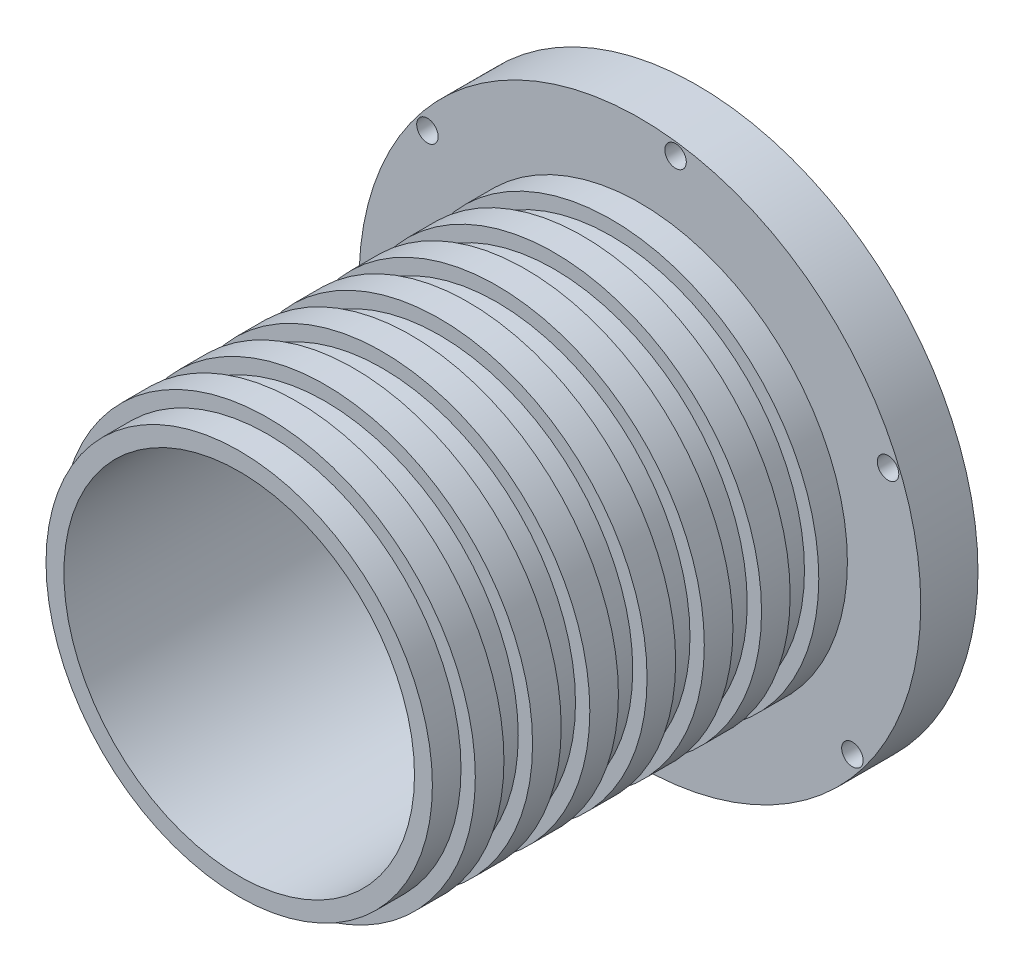
ISO-10303-21;
HEADER;
FILE_DESCRIPTION(('STEP AP214'),'2;1');
FILE_NAME('part.step','',(''),(''),'','','');
FILE_SCHEMA(('AUTOMOTIVE_DESIGN { 1 0 10303 214 1 1 1 1 }'));
ENDSEC;
DATA;
#1=APPLICATION_CONTEXT('core data for automotive mechanical design processes');
#2=APPLICATION_PROTOCOL_DEFINITION('international standard','automotive_design',2000,#1);
#3=PRODUCT_CONTEXT('',#1,'mechanical');
#4=PRODUCT('Part','Part','',(#3));
#5=PRODUCT_RELATED_PRODUCT_CATEGORY('part','',(#4));
#6=PRODUCT_DEFINITION_FORMATION('','',#4);
#7=PRODUCT_DEFINITION_CONTEXT('part definition',#1,'design');
#8=PRODUCT_DEFINITION('design','',#6,#7);
#9=PRODUCT_DEFINITION_SHAPE('','',#8);
#10=(LENGTH_UNIT() NAMED_UNIT(*) SI_UNIT(.MILLI.,.METRE.));
#11=(NAMED_UNIT(*) PLANE_ANGLE_UNIT() SI_UNIT($,.RADIAN.));
#12=(NAMED_UNIT(*) SI_UNIT($,.STERADIAN.) SOLID_ANGLE_UNIT());
#13=UNCERTAINTY_MEASURE_WITH_UNIT(LENGTH_MEASURE(1.E-05),#10,'distance_accuracy_value','');
#14=(GEOMETRIC_REPRESENTATION_CONTEXT(3) GLOBAL_UNCERTAINTY_ASSIGNED_CONTEXT((#13)) GLOBAL_UNIT_ASSIGNED_CONTEXT((#10,
#11,#12)) REPRESENTATION_CONTEXT('',''));
#15=CARTESIAN_POINT('',(0.,0.,0.));
#16=DIRECTION('',(0.,0.,1.));
#17=DIRECTION('',(1.,0.,0.));
#18=AXIS2_PLACEMENT_3D('',#15,#16,#17);
#19=CARTESIAN_POINT('',(0.,0.,68.));
#20=DIRECTION('',(0.,0.,-1.));
#21=DIRECTION('',(-1.,0.,0.));
#22=AXIS2_PLACEMENT_3D('',#19,#20,#21);
#23=CYLINDRICAL_SURFACE('',#22,27.);
#24=CARTESIAN_POINT('',(0.,0.,56.));
#25=DIRECTION('',(0.,0.,1.));
#26=DIRECTION('',(1.,0.,0.));
#27=AXIS2_PLACEMENT_3D('',#24,#25,#26);
#28=CIRCLE('',#27,27.);
#29=CARTESIAN_POINT('',(27.,0.,56.));
#30=VERTEX_POINT('',#29);
#31=EDGE_CURVE('E65',#30,#30,#28,.T.);
#32=ORIENTED_EDGE('',*,*,#31,.T.);
#33=EDGE_LOOP('',(#32));
#34=FACE_BOUND('',#33,.T.);
#35=CARTESIAN_POINT('',(0.,0.,60.));
#36=DIRECTION('',(0.,0.,1.));
#37=DIRECTION('',(1.,0.,0.));
#38=AXIS2_PLACEMENT_3D('',#35,#36,#37);
#39=CIRCLE('',#38,27.);
#40=CARTESIAN_POINT('',(27.,0.,60.));
#41=VERTEX_POINT('',#40);
#42=EDGE_CURVE('E10',#41,#41,#39,.T.);
#43=ORIENTED_EDGE('',*,*,#42,.F.);
#44=EDGE_LOOP('',(#43));
#45=FACE_BOUND('',#44,.T.);
#46=ADVANCED_FACE('F38',(#34,#45),#23,.T.);
#47=CARTESIAN_POINT('',(0.,0.,48.));
#48=DIRECTION('',(0.,0.,1.));
#49=DIRECTION('',(1.,0.,0.));
#50=AXIS2_PLACEMENT_3D('',#47,#48,#49);
#51=CIRCLE('',#50,27.);
#52=CARTESIAN_POINT('',(27.,0.,48.));
#53=VERTEX_POINT('',#52);
#54=EDGE_CURVE('E74',#53,#53,#51,.T.);
#55=ORIENTED_EDGE('',*,*,#54,.T.);
#56=EDGE_LOOP('',(#55));
#57=FACE_BOUND('',#56,.T.);
#58=CARTESIAN_POINT('',(0.,0.,52.));
#59=DIRECTION('',(0.,0.,1.));
#60=DIRECTION('',(1.,0.,0.));
#61=AXIS2_PLACEMENT_3D('',#58,#59,#60);
#62=CIRCLE('',#61,27.);
#63=CARTESIAN_POINT('',(27.,0.,52.));
#64=VERTEX_POINT('',#63);
#65=EDGE_CURVE('E46',#64,#64,#62,.T.);
#66=ORIENTED_EDGE('',*,*,#65,.F.);
#67=EDGE_LOOP('',(#66));
#68=FACE_BOUND('',#67,.T.);
#69=ADVANCED_FACE('F196',(#57,#68),#23,.T.);
#70=CARTESIAN_POINT('',(0.,0.,40.));
#71=DIRECTION('',(0.,0.,1.));
#72=DIRECTION('',(1.,0.,0.));
#73=AXIS2_PLACEMENT_3D('',#70,#71,#72);
#74=CIRCLE('',#73,27.);
#75=CARTESIAN_POINT('',(27.,0.,40.));
#76=VERTEX_POINT('',#75);
#77=EDGE_CURVE('E86',#76,#76,#74,.T.);
#78=ORIENTED_EDGE('',*,*,#77,.T.);
#79=EDGE_LOOP('',(#78));
#80=FACE_BOUND('',#79,.T.);
#81=CARTESIAN_POINT('',(0.,0.,44.));
#82=DIRECTION('',(0.,0.,1.));
#83=DIRECTION('',(1.,0.,0.));
#84=AXIS2_PLACEMENT_3D('',#81,#82,#83);
#85=CIRCLE('',#84,27.);
#86=CARTESIAN_POINT('',(27.,0.,44.));
#87=VERTEX_POINT('',#86);
#88=EDGE_CURVE('E51',#87,#87,#85,.T.);
#89=ORIENTED_EDGE('',*,*,#88,.F.);
#90=EDGE_LOOP('',(#89));
#91=FACE_BOUND('',#90,.T.);
#92=ADVANCED_FACE('F202',(#80,#91),#23,.T.);
#93=CARTESIAN_POINT('',(0.,0.,32.));
#94=DIRECTION('',(0.,0.,1.));
#95=DIRECTION('',(1.,0.,0.));
#96=AXIS2_PLACEMENT_3D('',#93,#94,#95);
#97=CIRCLE('',#96,27.);
#98=CARTESIAN_POINT('',(27.,0.,32.));
#99=VERTEX_POINT('',#98);
#100=EDGE_CURVE('E98',#99,#99,#97,.T.);
#101=ORIENTED_EDGE('',*,*,#100,.T.);
#102=EDGE_LOOP('',(#101));
#103=FACE_BOUND('',#102,.T.);
#104=CARTESIAN_POINT('',(0.,0.,36.));
#105=DIRECTION('',(0.,0.,1.));
#106=DIRECTION('',(1.,0.,0.));
#107=AXIS2_PLACEMENT_3D('',#104,#105,#106);
#108=CIRCLE('',#107,27.);
#109=CARTESIAN_POINT('',(27.,0.,36.));
#110=VERTEX_POINT('',#109);
#111=EDGE_CURVE('E79',#110,#110,#108,.T.);
#112=ORIENTED_EDGE('',*,*,#111,.F.);
#113=EDGE_LOOP('',(#112));
#114=FACE_BOUND('',#113,.T.);
#115=ADVANCED_FACE('F226',(#103,#114),#23,.T.);
#116=CARTESIAN_POINT('',(0.,0.,24.));
#117=DIRECTION('',(0.,0.,1.));
#118=DIRECTION('',(1.,0.,0.));
#119=AXIS2_PLACEMENT_3D('',#116,#117,#118);
#120=CIRCLE('',#119,27.);
#121=CARTESIAN_POINT('',(27.,0.,24.));
#122=VERTEX_POINT('',#121);
#123=EDGE_CURVE('E110',#122,#122,#120,.T.);
#124=ORIENTED_EDGE('',*,*,#123,.T.);
#125=EDGE_LOOP('',(#124));
#126=FACE_BOUND('',#125,.T.);
#127=CARTESIAN_POINT('',(0.,0.,28.));
#128=DIRECTION('',(0.,0.,1.));
#129=DIRECTION('',(1.,0.,0.));
#130=AXIS2_PLACEMENT_3D('',#127,#128,#129);
#131=CIRCLE('',#130,27.);
#132=CARTESIAN_POINT('',(27.,0.,28.));
#133=VERTEX_POINT('',#132);
#134=EDGE_CURVE('E91',#133,#133,#131,.T.);
#135=ORIENTED_EDGE('',*,*,#134,.F.);
#136=EDGE_LOOP('',(#135));
#137=FACE_BOUND('',#136,.T.);
#138=ADVANCED_FACE('F218',(#126,#137),#23,.T.);
#139=CARTESIAN_POINT('',(0.,0.,16.));
#140=DIRECTION('',(0.,0.,1.));
#141=DIRECTION('',(1.,0.,0.));
#142=AXIS2_PLACEMENT_3D('',#139,#140,#141);
#143=CIRCLE('',#142,27.);
#144=CARTESIAN_POINT('',(27.,0.,16.));
#145=VERTEX_POINT('',#144);
#146=EDGE_CURVE('E122',#145,#145,#143,.T.);
#147=ORIENTED_EDGE('',*,*,#146,.T.);
#148=EDGE_LOOP('',(#147));
#149=FACE_BOUND('',#148,.T.);
#150=CARTESIAN_POINT('',(0.,0.,20.));
#151=DIRECTION('',(0.,0.,1.));
#152=DIRECTION('',(1.,0.,0.));
#153=AXIS2_PLACEMENT_3D('',#150,#151,#152);
#154=CIRCLE('',#153,27.);
#155=CARTESIAN_POINT('',(27.,0.,20.));
#156=VERTEX_POINT('',#155);
#157=EDGE_CURVE('E103',#156,#156,#154,.T.);
#158=ORIENTED_EDGE('',*,*,#157,.F.);
#159=EDGE_LOOP('',(#158));
#160=FACE_BOUND('',#159,.T.);
#161=ADVANCED_FACE('F210',(#149,#160),#23,.T.);
#162=CARTESIAN_POINT('',(0.,0.,4.));
#163=DIRECTION('',(0.,0.,-1.));
#164=DIRECTION('',(-1.,0.,0.));
#165=AXIS2_PLACEMENT_3D('',#162,#163,#164);
#166=CYLINDRICAL_SURFACE('',#165,28.);
#167=CARTESIAN_POINT('',(0.,0.,4.));
#168=DIRECTION('',(0.,0.,1.));
#169=DIRECTION('',(1.,0.,0.));
#170=AXIS2_PLACEMENT_3D('',#167,#168,#169);
#171=CIRCLE('',#170,28.);
#172=CARTESIAN_POINT('',(28.,0.,4.));
#173=VERTEX_POINT('',#172);
#174=EDGE_CURVE('E115',#173,#173,#171,.T.);
#175=ORIENTED_EDGE('',*,*,#174,.F.);
#176=EDGE_LOOP('',(#175));
#177=FACE_BOUND('',#176,.T.);
#178=CARTESIAN_POINT('',(0.,0.,0.));
#179=DIRECTION('',(0.,0.,1.));
#180=DIRECTION('',(1.,0.,0.));
#181=AXIS2_PLACEMENT_3D('',#178,#179,#180);
#182=CIRCLE('',#181,28.);
#183=CARTESIAN_POINT('',(28.,0.,0.));
#184=VERTEX_POINT('',#183);
#185=EDGE_CURVE('E140',#184,#184,#182,.T.);
#186=ORIENTED_EDGE('',*,*,#185,.T.);
#187=EDGE_LOOP('',(#186));
#188=FACE_BOUND('',#187,.T.);
#189=ADVANCED_FACE('F40',(#177,#188),#166,.T.);
#190=CARTESIAN_POINT('',(0.,0.,0.));
#191=DIRECTION('',(0.,0.,1.));
#192=DIRECTION('',(1.,0.,0.));
#193=AXIS2_PLACEMENT_3D('',#190,#191,#192);
#194=PLANE('',#193);
#195=CARTESIAN_POINT('',(0.,0.,0.));
#196=DIRECTION('',(0.,0.,1.));
#197=DIRECTION('',(1.,0.,0.));
#198=AXIS2_PLACEMENT_3D('',#195,#196,#197);
#199=CIRCLE('',#198,24.5);
#200=CARTESIAN_POINT('',(24.5,0.,0.));
#201=VERTEX_POINT('',#200);
#202=EDGE_CURVE('E128',#201,#201,#199,.T.);
#203=ORIENTED_EDGE('',*,*,#202,.T.);
#204=EDGE_LOOP('',(#203));
#205=FACE_BOUND('',#204,.T.);
#206=ORIENTED_EDGE('',*,*,#185,.F.);
#207=EDGE_LOOP('',(#206));
#208=FACE_BOUND('',#207,.T.);
#209=ADVANCED_FACE('F224',(#205,#208),#194,.F.);
#210=CARTESIAN_POINT('',(0.,0.,12.));
#211=DIRECTION('',(0.,0.,-1.));
#212=DIRECTION('',(-1.,0.,0.));
#213=AXIS2_PLACEMENT_3D('',#210,#211,#212);
#214=CYLINDRICAL_SURFACE('',#213,39.25);
#215=CARTESIAN_POINT('',(0.,0.,12.));
#216=DIRECTION('',(0.,0.,1.));
#217=DIRECTION('',(1.,0.,0.));
#218=AXIS2_PLACEMENT_3D('',#215,#216,#217);
#219=CIRCLE('',#218,39.25);
#220=CARTESIAN_POINT('',(39.25,0.,12.));
#221=VERTEX_POINT('',#220);
#222=EDGE_CURVE('E137',#221,#221,#219,.T.);
#223=ORIENTED_EDGE('',*,*,#222,.F.);
#224=EDGE_LOOP('',(#223));
#225=FACE_BOUND('',#224,.T.);
#226=CARTESIAN_POINT('',(0.,0.,4.));
#227=DIRECTION('',(0.,0.,1.));
#228=DIRECTION('',(1.,0.,0.));
#229=AXIS2_PLACEMENT_3D('',#226,#227,#228);
#230=CIRCLE('',#229,39.25);
#231=CARTESIAN_POINT('',(39.25,0.,4.));
#232=VERTEX_POINT('',#231);
#233=EDGE_CURVE('E136',#232,#232,#230,.T.);
#234=ORIENTED_EDGE('',*,*,#233,.T.);
#235=EDGE_LOOP('',(#234));
#236=FACE_BOUND('',#235,.T.);
#237=ADVANCED_FACE('F273',(#225,#236),#214,.T.);
#238=CARTESIAN_POINT('',(0.,0.,12.));
#239=DIRECTION('',(0.,0.,1.));
#240=DIRECTION('',(1.,0.,0.));
#241=AXIS2_PLACEMENT_3D('',#238,#239,#240);
#242=PLANE('',#241);
#243=CARTESIAN_POINT('',(-29.6950799057526,22.9009220205425,12.));
#244=DIRECTION('',(0.,0.,1.));
#245=DIRECTION('',(0.499999999999998,0.86602540378444,0.));
#246=AXIS2_PLACEMENT_3D('',#243,#244,#245);
#247=CIRCLE('',#246,1.5);
#248=CARTESIAN_POINT('',(-28.9450799057526,24.1999601262191,12.));
#249=VERTEX_POINT('',#248);
#250=EDGE_CURVE('E155',#249,#249,#247,.T.);
#251=ORIENTED_EDGE('',*,*,#250,.F.);
#252=EDGE_LOOP('',(#251));
#253=FACE_BOUND('',#252,.T.);
#254=CARTESIAN_POINT('',(-34.6803201927525,-14.2662325555194,12.));
#255=DIRECTION('',(0.,0.,1.));
#256=DIRECTION('',(-0.500000000000004,0.866025403784436,0.));
#257=AXIS2_PLACEMENT_3D('',#254,#255,#256);
#258=CIRCLE('',#257,1.5);
#259=CARTESIAN_POINT('',(-35.4303201927525,-12.9671944498428,12.));
#260=VERTEX_POINT('',#259);
#261=EDGE_CURVE('E294',#260,#260,#258,.T.);
#262=ORIENTED_EDGE('',*,*,#261,.F.);
#263=EDGE_LOOP('',(#262));
#264=FACE_BOUND('',#263,.T.);
#265=CARTESIAN_POINT('',(-4.985240287,-37.1671545760618,12.));
#266=DIRECTION('',(0.,0.,1.));
#267=DIRECTION('',(-1.,0.,0.));
#268=AXIS2_PLACEMENT_3D('',#265,#266,#267);
#269=CIRCLE('',#268,1.5);
#270=CARTESIAN_POINT('',(-6.485240287,-37.1671545760618,12.));
#271=VERTEX_POINT('',#270);
#272=EDGE_CURVE('E298',#271,#271,#269,.T.);
#273=ORIENTED_EDGE('',*,*,#272,.F.);
#274=EDGE_LOOP('',(#273));
#275=FACE_BOUND('',#274,.T.);
#276=CARTESIAN_POINT('',(29.6950799057528,-22.9009220205423,12.));
#277=DIRECTION('',(0.,0.,1.));
#278=DIRECTION('',(-0.499999999999992,-0.866025403784443,0.));
#279=AXIS2_PLACEMENT_3D('',#276,#277,#278);
#280=CIRCLE('',#279,1.5);
#281=CARTESIAN_POINT('',(28.9450799057528,-24.1999601262189,12.));
#282=VERTEX_POINT('',#281);
#283=EDGE_CURVE('E302',#282,#282,#280,.T.);
#284=ORIENTED_EDGE('',*,*,#283,.F.);
#285=EDGE_LOOP('',(#284));
#286=FACE_BOUND('',#285,.T.);
#287=CARTESIAN_POINT('',(34.6803201927524,14.2662325555197,12.));
#288=DIRECTION('',(0.,0.,1.));
#289=DIRECTION('',(0.50000000000001,-0.866025403784433,0.));
#290=AXIS2_PLACEMENT_3D('',#287,#288,#289);
#291=CIRCLE('',#290,1.5);
#292=CARTESIAN_POINT('',(35.4303201927524,12.967194449843,12.));
#293=VERTEX_POINT('',#292);
#294=EDGE_CURVE('E172',#293,#293,#291,.T.);
#295=ORIENTED_EDGE('',*,*,#294,.F.);
#296=EDGE_LOOP('',(#295));
#297=FACE_BOUND('',#296,.T.);
#298=CARTESIAN_POINT('',(4.985240287,37.1671545760618,12.));
#299=DIRECTION('',(0.,0.,1.));
#300=DIRECTION('',(1.,0.,0.));
#301=AXIS2_PLACEMENT_3D('',#298,#299,#300);
#302=CIRCLE('',#301,1.5);
#303=CARTESIAN_POINT('',(6.485240287,37.1671545760618,12.));
#304=VERTEX_POINT('',#303);
#305=EDGE_CURVE('E150',#304,#304,#302,.T.);
#306=ORIENTED_EDGE('',*,*,#305,.F.);
#307=EDGE_LOOP('',(#306));
#308=FACE_BOUND('',#307,.T.);
#309=CARTESIAN_POINT('',(0.,0.,12.));
#310=DIRECTION('',(0.,0.,1.));
#311=DIRECTION('',(1.,0.,0.));
#312=AXIS2_PLACEMENT_3D('',#309,#310,#311);
#313=CIRCLE('',#312,29.);
#314=CARTESIAN_POINT('',(29.,0.,12.));
#315=VERTEX_POINT('',#314);
#316=EDGE_CURVE('E118',#315,#315,#313,.T.);
#317=ORIENTED_EDGE('',*,*,#316,.F.);
#318=EDGE_LOOP('',(#317));
#319=FACE_BOUND('',#318,.T.);
#320=ORIENTED_EDGE('',*,*,#222,.T.);
#321=EDGE_LOOP('',(#320));
#322=FACE_BOUND('',#321,.T.);
#323=ADVANCED_FACE('F279',(#253,#264,#275,#286,#297,#308,#319,#322),#242,.T.);
#324=CARTESIAN_POINT('',(0.,0.,4.));
#325=DIRECTION('',(0.,0.,1.));
#326=DIRECTION('',(1.,0.,0.));
#327=AXIS2_PLACEMENT_3D('',#324,#325,#326);
#328=PLANE('',#327);
#329=CARTESIAN_POINT('',(-29.6950799057526,22.9009220205425,4.));
#330=DIRECTION('',(0.,0.,1.));
#331=DIRECTION('',(1.,0.,0.));
#332=AXIS2_PLACEMENT_3D('',#329,#330,#331);
#333=CIRCLE('',#332,1.5);
#334=CARTESIAN_POINT('',(-28.1950799057526,22.9009220205425,4.));
#335=VERTEX_POINT('',#334);
#336=EDGE_CURVE('E42',#335,#335,#333,.T.);
#337=ORIENTED_EDGE('',*,*,#336,.T.);
#338=EDGE_LOOP('',(#337));
#339=FACE_BOUND('',#338,.T.);
#340=CARTESIAN_POINT('',(-34.6803201927525,-14.2662325555194,4.));
#341=DIRECTION('',(0.,0.,1.));
#342=DIRECTION('',(1.,0.,0.));
#343=AXIS2_PLACEMENT_3D('',#340,#341,#342);
#344=CIRCLE('',#343,1.5);
#345=CARTESIAN_POINT('',(-33.1803201927525,-14.2662325555194,4.));
#346=VERTEX_POINT('',#345);
#347=EDGE_CURVE('E160',#346,#346,#344,.T.);
#348=ORIENTED_EDGE('',*,*,#347,.T.);
#349=EDGE_LOOP('',(#348));
#350=FACE_BOUND('',#349,.T.);
#351=CARTESIAN_POINT('',(-4.985240287,-37.1671545760618,4.));
#352=DIRECTION('',(0.,0.,1.));
#353=DIRECTION('',(1.,0.,0.));
#354=AXIS2_PLACEMENT_3D('',#351,#352,#353);
#355=CIRCLE('',#354,1.5);
#356=CARTESIAN_POINT('',(-3.485240287,-37.1671545760618,4.));
#357=VERTEX_POINT('',#356);
#358=EDGE_CURVE('E158',#357,#357,#355,.T.);
#359=ORIENTED_EDGE('',*,*,#358,.T.);
#360=EDGE_LOOP('',(#359));
#361=FACE_BOUND('',#360,.T.);
#362=CARTESIAN_POINT('',(29.6950799057528,-22.9009220205423,4.));
#363=DIRECTION('',(0.,0.,1.));
#364=DIRECTION('',(1.,0.,0.));
#365=AXIS2_PLACEMENT_3D('',#362,#363,#364);
#366=CIRCLE('',#365,1.5);
#367=CARTESIAN_POINT('',(31.1950799057528,-22.9009220205423,4.));
#368=VERTEX_POINT('',#367);
#369=EDGE_CURVE('E154',#368,#368,#366,.T.);
#370=ORIENTED_EDGE('',*,*,#369,.T.);
#371=EDGE_LOOP('',(#370));
#372=FACE_BOUND('',#371,.T.);
#373=CARTESIAN_POINT('',(34.6803201927524,14.2662325555197,4.));
#374=DIRECTION('',(0.,0.,1.));
#375=DIRECTION('',(1.,0.,0.));
#376=AXIS2_PLACEMENT_3D('',#373,#374,#375);
#377=CIRCLE('',#376,1.5);
#378=CARTESIAN_POINT('',(36.1803201927524,14.2662325555197,4.));
#379=VERTEX_POINT('',#378);
#380=EDGE_CURVE('E151',#379,#379,#377,.T.);
#381=ORIENTED_EDGE('',*,*,#380,.T.);
#382=EDGE_LOOP('',(#381));
#383=FACE_BOUND('',#382,.T.);
#384=CARTESIAN_POINT('',(4.985240287,37.1671545760618,4.));
#385=DIRECTION('',(0.,0.,1.));
#386=DIRECTION('',(1.,0.,0.));
#387=AXIS2_PLACEMENT_3D('',#384,#385,#386);
#388=CIRCLE('',#387,1.5);
#389=CARTESIAN_POINT('',(6.485240287,37.1671545760618,4.));
#390=VERTEX_POINT('',#389);
#391=EDGE_CURVE('E147',#390,#390,#388,.T.);
#392=ORIENTED_EDGE('',*,*,#391,.T.);
#393=EDGE_LOOP('',(#392));
#394=FACE_BOUND('',#393,.T.);
#395=ORIENTED_EDGE('',*,*,#174,.T.);
#396=EDGE_LOOP('',(#395));
#397=FACE_BOUND('',#396,.T.);
#398=ORIENTED_EDGE('',*,*,#233,.F.);
#399=EDGE_LOOP('',(#398));
#400=FACE_BOUND('',#399,.T.);
#401=ADVANCED_FACE('F254',(#339,#350,#361,#372,#383,#394,#397,#400),#328,.F.);
#402=CARTESIAN_POINT('',(0.,0.,16.));
#403=DIRECTION('',(0.,0.,1.));
#404=DIRECTION('',(1.,0.,0.));
#405=AXIS2_PLACEMENT_3D('',#402,#403,#404);
#406=PLANE('',#405);
#407=CARTESIAN_POINT('',(0.,0.,16.));
#408=DIRECTION('',(0.,0.,1.));
#409=DIRECTION('',(1.,0.,0.));
#410=AXIS2_PLACEMENT_3D('',#407,#408,#409);
#411=CIRCLE('',#410,29.);
#412=CARTESIAN_POINT('',(29.,0.,16.));
#413=VERTEX_POINT('',#412);
#414=EDGE_CURVE('E119',#413,#413,#411,.T.);
#415=ORIENTED_EDGE('',*,*,#414,.T.);
#416=EDGE_LOOP('',(#415));
#417=FACE_BOUND('',#416,.T.);
#418=ORIENTED_EDGE('',*,*,#146,.F.);
#419=EDGE_LOOP('',(#418));
#420=FACE_BOUND('',#419,.T.);
#421=ADVANCED_FACE('F251',(#417,#420),#406,.T.);
#422=CARTESIAN_POINT('',(0.,0.,16.));
#423=DIRECTION('',(0.,0.,-1.));
#424=DIRECTION('',(-1.,0.,0.));
#425=AXIS2_PLACEMENT_3D('',#422,#423,#424);
#426=CYLINDRICAL_SURFACE('',#425,29.);
#427=ORIENTED_EDGE('',*,*,#414,.F.);
#428=EDGE_LOOP('',(#427));
#429=FACE_BOUND('',#428,.T.);
#430=ORIENTED_EDGE('',*,*,#316,.T.);
#431=EDGE_LOOP('',(#430));
#432=FACE_BOUND('',#431,.T.);
#433=ADVANCED_FACE('F245',(#429,#432),#426,.T.);
#434=CARTESIAN_POINT('',(0.,0.,24.));
#435=DIRECTION('',(0.,0.,1.));
#436=DIRECTION('',(1.,0.,0.));
#437=AXIS2_PLACEMENT_3D('',#434,#435,#436);
#438=PLANE('',#437);
#439=CARTESIAN_POINT('',(0.,0.,24.));
#440=DIRECTION('',(0.,0.,1.));
#441=DIRECTION('',(1.,0.,0.));
#442=AXIS2_PLACEMENT_3D('',#439,#440,#441);
#443=CIRCLE('',#442,29.);
#444=CARTESIAN_POINT('',(29.,0.,24.));
#445=VERTEX_POINT('',#444);
#446=EDGE_CURVE('E107',#445,#445,#443,.T.);
#447=ORIENTED_EDGE('',*,*,#446,.T.);
#448=EDGE_LOOP('',(#447));
#449=FACE_BOUND('',#448,.T.);
#450=ORIENTED_EDGE('',*,*,#123,.F.);
#451=EDGE_LOOP('',(#450));
#452=FACE_BOUND('',#451,.T.);
#453=ADVANCED_FACE('F235',(#449,#452),#438,.T.);
#454=CARTESIAN_POINT('',(0.,0.,20.));
#455=DIRECTION('',(0.,0.,1.));
#456=DIRECTION('',(1.,0.,0.));
#457=AXIS2_PLACEMENT_3D('',#454,#455,#456);
#458=PLANE('',#457);
#459=CARTESIAN_POINT('',(0.,0.,20.));
#460=DIRECTION('',(0.,0.,1.));
#461=DIRECTION('',(1.,0.,0.));
#462=AXIS2_PLACEMENT_3D('',#459,#460,#461);
#463=CIRCLE('',#462,29.);
#464=CARTESIAN_POINT('',(29.,0.,20.));
#465=VERTEX_POINT('',#464);
#466=EDGE_CURVE('E106',#465,#465,#463,.T.);
#467=ORIENTED_EDGE('',*,*,#466,.F.);
#468=EDGE_LOOP('',(#467));
#469=FACE_BOUND('',#468,.T.);
#470=ORIENTED_EDGE('',*,*,#157,.T.);
#471=EDGE_LOOP('',(#470));
#472=FACE_BOUND('',#471,.T.);
#473=ADVANCED_FACE('F232',(#469,#472),#458,.F.);
#474=CARTESIAN_POINT('',(0.,0.,24.));
#475=DIRECTION('',(0.,0.,-1.));
#476=DIRECTION('',(-1.,0.,0.));
#477=AXIS2_PLACEMENT_3D('',#474,#475,#476);
#478=CYLINDRICAL_SURFACE('',#477,29.);
#479=ORIENTED_EDGE('',*,*,#446,.F.);
#480=EDGE_LOOP('',(#479));
#481=FACE_BOUND('',#480,.T.);
#482=ORIENTED_EDGE('',*,*,#466,.T.);
#483=EDGE_LOOP('',(#482));
#484=FACE_BOUND('',#483,.T.);
#485=ADVANCED_FACE('F234',(#481,#484),#478,.T.);
#486=CARTESIAN_POINT('',(0.,0.,32.));
#487=DIRECTION('',(0.,0.,1.));
#488=DIRECTION('',(1.,0.,0.));
#489=AXIS2_PLACEMENT_3D('',#486,#487,#488);
#490=PLANE('',#489);
#491=CARTESIAN_POINT('',(0.,0.,32.));
#492=DIRECTION('',(0.,0.,1.));
#493=DIRECTION('',(1.,0.,0.));
#494=AXIS2_PLACEMENT_3D('',#491,#492,#493);
#495=CIRCLE('',#494,29.);
#496=CARTESIAN_POINT('',(29.,0.,32.));
#497=VERTEX_POINT('',#496);
#498=EDGE_CURVE('E95',#497,#497,#495,.T.);
#499=ORIENTED_EDGE('',*,*,#498,.T.);
#500=EDGE_LOOP('',(#499));
#501=FACE_BOUND('',#500,.T.);
#502=ORIENTED_EDGE('',*,*,#100,.F.);
#503=EDGE_LOOP('',(#502));
#504=FACE_BOUND('',#503,.T.);
#505=ADVANCED_FACE('F242',(#501,#504),#490,.T.);
#506=CARTESIAN_POINT('',(0.,0.,28.));
#507=DIRECTION('',(0.,0.,1.));
#508=DIRECTION('',(1.,0.,0.));
#509=AXIS2_PLACEMENT_3D('',#506,#507,#508);
#510=PLANE('',#509);
#511=CARTESIAN_POINT('',(0.,0.,28.));
#512=DIRECTION('',(0.,0.,1.));
#513=DIRECTION('',(1.,0.,0.));
#514=AXIS2_PLACEMENT_3D('',#511,#512,#513);
#515=CIRCLE('',#514,29.);
#516=CARTESIAN_POINT('',(29.,0.,28.));
#517=VERTEX_POINT('',#516);
#518=EDGE_CURVE('E94',#517,#517,#515,.T.);
#519=ORIENTED_EDGE('',*,*,#518,.F.);
#520=EDGE_LOOP('',(#519));
#521=FACE_BOUND('',#520,.T.);
#522=ORIENTED_EDGE('',*,*,#134,.T.);
#523=EDGE_LOOP('',(#522));
#524=FACE_BOUND('',#523,.T.);
#525=ADVANCED_FACE('F468',(#521,#524),#510,.F.);
#526=CARTESIAN_POINT('',(0.,0.,32.));
#527=DIRECTION('',(0.,0.,-1.));
#528=DIRECTION('',(-1.,0.,0.));
#529=AXIS2_PLACEMENT_3D('',#526,#527,#528);
#530=CYLINDRICAL_SURFACE('',#529,29.);
#531=ORIENTED_EDGE('',*,*,#498,.F.);
#532=EDGE_LOOP('',(#531));
#533=FACE_BOUND('',#532,.T.);
#534=ORIENTED_EDGE('',*,*,#518,.T.);
#535=EDGE_LOOP('',(#534));
#536=FACE_BOUND('',#535,.T.);
#537=ADVANCED_FACE('F479',(#533,#536),#530,.T.);
#538=CARTESIAN_POINT('',(0.,0.,40.));
#539=DIRECTION('',(0.,0.,1.));
#540=DIRECTION('',(1.,0.,0.));
#541=AXIS2_PLACEMENT_3D('',#538,#539,#540);
#542=PLANE('',#541);
#543=CARTESIAN_POINT('',(0.,0.,40.));
#544=DIRECTION('',(0.,0.,1.));
#545=DIRECTION('',(1.,0.,0.));
#546=AXIS2_PLACEMENT_3D('',#543,#544,#545);
#547=CIRCLE('',#546,29.);
#548=CARTESIAN_POINT('',(29.,0.,40.));
#549=VERTEX_POINT('',#548);
#550=EDGE_CURVE('E83',#549,#549,#547,.T.);
#551=ORIENTED_EDGE('',*,*,#550,.T.);
#552=EDGE_LOOP('',(#551));
#553=FACE_BOUND('',#552,.T.);
#554=ORIENTED_EDGE('',*,*,#77,.F.);
#555=EDGE_LOOP('',(#554));
#556=FACE_BOUND('',#555,.T.);
#557=ADVANCED_FACE('F490',(#553,#556),#542,.T.);
#558=CARTESIAN_POINT('',(0.,0.,36.));
#559=DIRECTION('',(0.,0.,1.));
#560=DIRECTION('',(1.,0.,0.));
#561=AXIS2_PLACEMENT_3D('',#558,#559,#560);
#562=PLANE('',#561);
#563=CARTESIAN_POINT('',(0.,0.,36.));
#564=DIRECTION('',(0.,0.,1.));
#565=DIRECTION('',(1.,0.,0.));
#566=AXIS2_PLACEMENT_3D('',#563,#564,#565);
#567=CIRCLE('',#566,29.);
#568=CARTESIAN_POINT('',(29.,0.,36.));
#569=VERTEX_POINT('',#568);
#570=EDGE_CURVE('E82',#569,#569,#567,.T.);
#571=ORIENTED_EDGE('',*,*,#570,.F.);
#572=EDGE_LOOP('',(#571));
#573=FACE_BOUND('',#572,.T.);
#574=ORIENTED_EDGE('',*,*,#111,.T.);
#575=EDGE_LOOP('',(#574));
#576=FACE_BOUND('',#575,.T.);
#577=ADVANCED_FACE('F500',(#573,#576),#562,.F.);
#578=CARTESIAN_POINT('',(0.,0.,40.));
#579=DIRECTION('',(0.,0.,-1.));
#580=DIRECTION('',(-1.,0.,0.));
#581=AXIS2_PLACEMENT_3D('',#578,#579,#580);
#582=CYLINDRICAL_SURFACE('',#581,29.);
#583=ORIENTED_EDGE('',*,*,#550,.F.);
#584=EDGE_LOOP('',(#583));
#585=FACE_BOUND('',#584,.T.);
#586=ORIENTED_EDGE('',*,*,#570,.T.);
#587=EDGE_LOOP('',(#586));
#588=FACE_BOUND('',#587,.T.);
#589=ADVANCED_FACE('F511',(#585,#588),#582,.T.);
#590=CARTESIAN_POINT('',(0.,0.,48.));
#591=DIRECTION('',(0.,0.,1.));
#592=DIRECTION('',(1.,0.,0.));
#593=AXIS2_PLACEMENT_3D('',#590,#591,#592);
#594=PLANE('',#593);
#595=CARTESIAN_POINT('',(0.,0.,48.));
#596=DIRECTION('',(0.,0.,1.));
#597=DIRECTION('',(1.,0.,0.));
#598=AXIS2_PLACEMENT_3D('',#595,#596,#597);
#599=CIRCLE('',#598,29.);
#600=CARTESIAN_POINT('',(29.,0.,48.));
#601=VERTEX_POINT('',#600);
#602=EDGE_CURVE('E71',#601,#601,#599,.T.);
#603=ORIENTED_EDGE('',*,*,#602,.T.);
#604=EDGE_LOOP('',(#603));
#605=FACE_BOUND('',#604,.T.);
#606=ORIENTED_EDGE('',*,*,#54,.F.);
#607=EDGE_LOOP('',(#606));
#608=FACE_BOUND('',#607,.T.);
#609=ADVANCED_FACE('F522',(#605,#608),#594,.T.);
#610=CARTESIAN_POINT('',(0.,0.,44.));
#611=DIRECTION('',(0.,0.,1.));
#612=DIRECTION('',(1.,0.,0.));
#613=AXIS2_PLACEMENT_3D('',#610,#611,#612);
#614=PLANE('',#613);
#615=CARTESIAN_POINT('',(0.,0.,44.));
#616=DIRECTION('',(0.,0.,1.));
#617=DIRECTION('',(1.,0.,0.));
#618=AXIS2_PLACEMENT_3D('',#615,#616,#617);
#619=CIRCLE('',#618,29.);
#620=CARTESIAN_POINT('',(29.,0.,44.));
#621=VERTEX_POINT('',#620);
#622=EDGE_CURVE('E70',#621,#621,#619,.T.);
#623=ORIENTED_EDGE('',*,*,#622,.F.);
#624=EDGE_LOOP('',(#623));
#625=FACE_BOUND('',#624,.T.);
#626=ORIENTED_EDGE('',*,*,#88,.T.);
#627=EDGE_LOOP('',(#626));
#628=FACE_BOUND('',#627,.T.);
#629=ADVANCED_FACE('F533',(#625,#628),#614,.F.);
#630=CARTESIAN_POINT('',(0.,0.,48.));
#631=DIRECTION('',(0.,0.,-1.));
#632=DIRECTION('',(-1.,0.,0.));
#633=AXIS2_PLACEMENT_3D('',#630,#631,#632);
#634=CYLINDRICAL_SURFACE('',#633,29.);
#635=ORIENTED_EDGE('',*,*,#602,.F.);
#636=EDGE_LOOP('',(#635));
#637=FACE_BOUND('',#636,.T.);
#638=ORIENTED_EDGE('',*,*,#622,.T.);
#639=EDGE_LOOP('',(#638));
#640=FACE_BOUND('',#639,.T.);
#641=ADVANCED_FACE('F544',(#637,#640),#634,.T.);
#642=CARTESIAN_POINT('',(0.,0.,56.));
#643=DIRECTION('',(0.,0.,1.));
#644=DIRECTION('',(1.,0.,0.));
#645=AXIS2_PLACEMENT_3D('',#642,#643,#644);
#646=PLANE('',#645);
#647=CARTESIAN_POINT('',(0.,0.,56.));
#648=DIRECTION('',(0.,0.,1.));
#649=DIRECTION('',(1.,0.,0.));
#650=AXIS2_PLACEMENT_3D('',#647,#648,#649);
#651=CIRCLE('',#650,29.);
#652=CARTESIAN_POINT('',(29.,0.,56.));
#653=VERTEX_POINT('',#652);
#654=EDGE_CURVE('E62',#653,#653,#651,.T.);
#655=ORIENTED_EDGE('',*,*,#654,.T.);
#656=EDGE_LOOP('',(#655));
#657=FACE_BOUND('',#656,.T.);
#658=ORIENTED_EDGE('',*,*,#31,.F.);
#659=EDGE_LOOP('',(#658));
#660=FACE_BOUND('',#659,.T.);
#661=ADVANCED_FACE('F555',(#657,#660),#646,.T.);
#662=CARTESIAN_POINT('',(0.,0.,52.));
#663=DIRECTION('',(0.,0.,1.));
#664=DIRECTION('',(1.,0.,0.));
#665=AXIS2_PLACEMENT_3D('',#662,#663,#664);
#666=PLANE('',#665);
#667=CARTESIAN_POINT('',(0.,0.,52.));
#668=DIRECTION('',(0.,0.,1.));
#669=DIRECTION('',(1.,0.,0.));
#670=AXIS2_PLACEMENT_3D('',#667,#668,#669);
#671=CIRCLE('',#670,29.);
#672=CARTESIAN_POINT('',(29.,0.,52.));
#673=VERTEX_POINT('',#672);
#674=EDGE_CURVE('E60',#673,#673,#671,.T.);
#675=ORIENTED_EDGE('',*,*,#674,.F.);
#676=EDGE_LOOP('',(#675));
#677=FACE_BOUND('',#676,.T.);
#678=ORIENTED_EDGE('',*,*,#65,.T.);
#679=EDGE_LOOP('',(#678));
#680=FACE_BOUND('',#679,.T.);
#681=ADVANCED_FACE('F566',(#677,#680),#666,.F.);
#682=CARTESIAN_POINT('',(0.,0.,56.));
#683=DIRECTION('',(0.,0.,-1.));
#684=DIRECTION('',(-1.,0.,0.));
#685=AXIS2_PLACEMENT_3D('',#682,#683,#684);
#686=CYLINDRICAL_SURFACE('',#685,29.);
#687=ORIENTED_EDGE('',*,*,#654,.F.);
#688=EDGE_LOOP('',(#687));
#689=FACE_BOUND('',#688,.T.);
#690=ORIENTED_EDGE('',*,*,#674,.T.);
#691=EDGE_LOOP('',(#690));
#692=FACE_BOUND('',#691,.T.);
#693=ADVANCED_FACE('F193',(#689,#692),#686,.T.);
#694=CARTESIAN_POINT('',(0.,0.,64.));
#695=DIRECTION('',(0.,0.,1.));
#696=DIRECTION('',(1.,0.,0.));
#697=AXIS2_PLACEMENT_3D('',#694,#695,#696);
#698=PLANE('',#697);
#699=CARTESIAN_POINT('',(0.,0.,64.));
#700=DIRECTION('',(0.,0.,1.));
#701=DIRECTION('',(1.,0.,0.));
#702=AXIS2_PLACEMENT_3D('',#699,#700,#701);
#703=CIRCLE('',#702,29.);
#704=CARTESIAN_POINT('',(29.,0.,64.));
#705=VERTEX_POINT('',#704);
#706=EDGE_CURVE('E61',#705,#705,#703,.T.);
#707=ORIENTED_EDGE('',*,*,#706,.T.);
#708=EDGE_LOOP('',(#707));
#709=FACE_BOUND('',#708,.T.);
#710=CARTESIAN_POINT('',(0.,0.,64.));
#711=DIRECTION('',(0.,0.,1.));
#712=DIRECTION('',(1.,0.,0.));
#713=AXIS2_PLACEMENT_3D('',#710,#711,#712);
#714=CIRCLE('',#713,27.);
#715=CARTESIAN_POINT('',(27.,0.,64.));
#716=VERTEX_POINT('',#715);
#717=EDGE_CURVE('E57',#716,#716,#714,.T.);
#718=ORIENTED_EDGE('',*,*,#717,.F.);
#719=EDGE_LOOP('',(#718));
#720=FACE_BOUND('',#719,.T.);
#721=ADVANCED_FACE('F184',(#709,#720),#698,.T.);
#722=CARTESIAN_POINT('',(0.,0.,60.));
#723=DIRECTION('',(0.,0.,1.));
#724=DIRECTION('',(1.,0.,0.));
#725=AXIS2_PLACEMENT_3D('',#722,#723,#724);
#726=PLANE('',#725);
#727=CARTESIAN_POINT('',(0.,0.,60.));
#728=DIRECTION('',(0.,0.,1.));
#729=DIRECTION('',(1.,0.,0.));
#730=AXIS2_PLACEMENT_3D('',#727,#728,#729);
#731=CIRCLE('',#730,29.);
#732=CARTESIAN_POINT('',(29.,0.,60.));
#733=VERTEX_POINT('',#732);
#734=EDGE_CURVE('E55',#733,#733,#731,.T.);
#735=ORIENTED_EDGE('',*,*,#734,.F.);
#736=EDGE_LOOP('',(#735));
#737=FACE_BOUND('',#736,.T.);
#738=ORIENTED_EDGE('',*,*,#42,.T.);
#739=EDGE_LOOP('',(#738));
#740=FACE_BOUND('',#739,.T.);
#741=ADVANCED_FACE('F182',(#737,#740),#726,.F.);
#742=CARTESIAN_POINT('',(0.,0.,64.));
#743=DIRECTION('',(0.,0.,-1.));
#744=DIRECTION('',(-1.,0.,0.));
#745=AXIS2_PLACEMENT_3D('',#742,#743,#744);
#746=CYLINDRICAL_SURFACE('',#745,29.);
#747=ORIENTED_EDGE('',*,*,#706,.F.);
#748=EDGE_LOOP('',(#747));
#749=FACE_BOUND('',#748,.T.);
#750=ORIENTED_EDGE('',*,*,#734,.T.);
#751=EDGE_LOOP('',(#750));
#752=FACE_BOUND('',#751,.T.);
#753=ADVANCED_FACE('F180',(#749,#752),#746,.T.);
#754=ORIENTED_EDGE('',*,*,#717,.T.);
#755=EDGE_LOOP('',(#754));
#756=FACE_BOUND('',#755,.T.);
#757=CARTESIAN_POINT('',(0.,0.,68.));
#758=DIRECTION('',(0.,0.,1.));
#759=DIRECTION('',(1.,0.,0.));
#760=AXIS2_PLACEMENT_3D('',#757,#758,#759);
#761=CIRCLE('',#760,27.);
#762=CARTESIAN_POINT('',(27.,0.,68.));
#763=VERTEX_POINT('',#762);
#764=EDGE_CURVE('E131',#763,#763,#761,.T.);
#765=ORIENTED_EDGE('',*,*,#764,.F.);
#766=EDGE_LOOP('',(#765));
#767=FACE_BOUND('',#766,.T.);
#768=ADVANCED_FACE('F190',(#756,#767),#23,.T.);
#769=CARTESIAN_POINT('',(0.,0.,68.));
#770=DIRECTION('',(0.,0.,1.));
#771=DIRECTION('',(1.,0.,0.));
#772=AXIS2_PLACEMENT_3D('',#769,#770,#771);
#773=PLANE('',#772);
#774=CARTESIAN_POINT('',(0.,0.,68.));
#775=DIRECTION('',(0.,0.,1.));
#776=DIRECTION('',(1.,0.,0.));
#777=AXIS2_PLACEMENT_3D('',#774,#775,#776);
#778=CIRCLE('',#777,24.5);
#779=CARTESIAN_POINT('',(24.5,0.,68.));
#780=VERTEX_POINT('',#779);
#781=EDGE_CURVE('E127',#780,#780,#778,.T.);
#782=ORIENTED_EDGE('',*,*,#781,.F.);
#783=EDGE_LOOP('',(#782));
#784=FACE_BOUND('',#783,.T.);
#785=ORIENTED_EDGE('',*,*,#764,.T.);
#786=EDGE_LOOP('',(#785));
#787=FACE_BOUND('',#786,.T.);
#788=ADVANCED_FACE('F208',(#784,#787),#773,.T.);
#789=CARTESIAN_POINT('',(0.,0.,0.));
#790=DIRECTION('',(0.,0.,1.));
#791=DIRECTION('',(1.,0.,0.));
#792=AXIS2_PLACEMENT_3D('',#789,#790,#791);
#793=CYLINDRICAL_SURFACE('',#792,24.5);
#794=ORIENTED_EDGE('',*,*,#781,.T.);
#795=EDGE_LOOP('',(#794));
#796=FACE_BOUND('',#795,.T.);
#797=ORIENTED_EDGE('',*,*,#202,.F.);
#798=EDGE_LOOP('',(#797));
#799=FACE_BOUND('',#798,.T.);
#800=ADVANCED_FACE('F214',(#796,#799),#793,.F.);
#801=CARTESIAN_POINT('',(4.985240287,37.1671545760618,0.));
#802=DIRECTION('',(0.,0.,1.));
#803=DIRECTION('',(1.,0.,0.));
#804=AXIS2_PLACEMENT_3D('',#801,#802,#803);
#805=CYLINDRICAL_SURFACE('',#804,1.5);
#806=ORIENTED_EDGE('',*,*,#305,.T.);
#807=EDGE_LOOP('',(#806));
#808=FACE_BOUND('',#807,.T.);
#809=ORIENTED_EDGE('',*,*,#391,.F.);
#810=EDGE_LOOP('',(#809));
#811=FACE_BOUND('',#810,.T.);
#812=ADVANCED_FACE('F260',(#808,#811),#805,.F.);
#813=CARTESIAN_POINT('',(34.6803201927524,14.2662325555197,0.));
#814=DIRECTION('',(0.,0.,1.));
#815=DIRECTION('',(1.,0.,0.));
#816=AXIS2_PLACEMENT_3D('',#813,#814,#815);
#817=CYLINDRICAL_SURFACE('',#816,1.5);
#818=ORIENTED_EDGE('',*,*,#294,.T.);
#819=EDGE_LOOP('',(#818));
#820=FACE_BOUND('',#819,.T.);
#821=ORIENTED_EDGE('',*,*,#380,.F.);
#822=EDGE_LOOP('',(#821));
#823=FACE_BOUND('',#822,.T.);
#824=ADVANCED_FACE('F265',(#820,#823),#817,.F.);
#825=CARTESIAN_POINT('',(29.6950799057528,-22.9009220205423,0.));
#826=DIRECTION('',(0.,0.,1.));
#827=DIRECTION('',(1.,0.,0.));
#828=AXIS2_PLACEMENT_3D('',#825,#826,#827);
#829=CYLINDRICAL_SURFACE('',#828,1.5);
#830=ORIENTED_EDGE('',*,*,#283,.T.);
#831=EDGE_LOOP('',(#830));
#832=FACE_BOUND('',#831,.T.);
#833=ORIENTED_EDGE('',*,*,#369,.F.);
#834=EDGE_LOOP('',(#833));
#835=FACE_BOUND('',#834,.T.);
#836=ADVANCED_FACE('F334',(#832,#835),#829,.F.);
#837=CARTESIAN_POINT('',(-4.985240287,-37.1671545760618,0.));
#838=DIRECTION('',(0.,0.,1.));
#839=DIRECTION('',(1.,0.,0.));
#840=AXIS2_PLACEMENT_3D('',#837,#838,#839);
#841=CYLINDRICAL_SURFACE('',#840,1.5);
#842=ORIENTED_EDGE('',*,*,#272,.T.);
#843=EDGE_LOOP('',(#842));
#844=FACE_BOUND('',#843,.T.);
#845=ORIENTED_EDGE('',*,*,#358,.F.);
#846=EDGE_LOOP('',(#845));
#847=FACE_BOUND('',#846,.T.);
#848=ADVANCED_FACE('F328',(#844,#847),#841,.F.);
#849=CARTESIAN_POINT('',(-34.6803201927525,-14.2662325555194,0.));
#850=DIRECTION('',(0.,0.,1.));
#851=DIRECTION('',(1.,0.,0.));
#852=AXIS2_PLACEMENT_3D('',#849,#850,#851);
#853=CYLINDRICAL_SURFACE('',#852,1.5);
#854=ORIENTED_EDGE('',*,*,#261,.T.);
#855=EDGE_LOOP('',(#854));
#856=FACE_BOUND('',#855,.T.);
#857=ORIENTED_EDGE('',*,*,#347,.F.);
#858=EDGE_LOOP('',(#857));
#859=FACE_BOUND('',#858,.T.);
#860=ADVANCED_FACE('F323',(#856,#859),#853,.F.);
#861=CARTESIAN_POINT('',(-29.6950799057526,22.9009220205425,0.));
#862=DIRECTION('',(0.,0.,1.));
#863=DIRECTION('',(1.,0.,0.));
#864=AXIS2_PLACEMENT_3D('',#861,#862,#863);
#865=CYLINDRICAL_SURFACE('',#864,1.5);
#866=ORIENTED_EDGE('',*,*,#250,.T.);
#867=EDGE_LOOP('',(#866));
#868=FACE_BOUND('',#867,.T.);
#869=ORIENTED_EDGE('',*,*,#336,.F.);
#870=EDGE_LOOP('',(#869));
#871=FACE_BOUND('',#870,.T.);
#872=ADVANCED_FACE('F320',(#868,#871),#865,.F.);
#873=CLOSED_SHELL('',(#46,#69,#92,#115,#138,#161,#189,#209,#237,#323,#401,#421,#433,#453,#473,
#485,#505,#525,#537,#557,#577,#589,#609,#629,#641,#661,#681,#693,#721,#741,#753,#768,#788,#800,
#812,#824,#836,#848,#860,#872));
#874=MANIFOLD_SOLID_BREP('B2',#873);
#875=ADVANCED_BREP_SHAPE_REPRESENTATION('',(#18,#874),#14);
#876=SHAPE_DEFINITION_REPRESENTATION(#9,#875);
ENDSEC;
END-ISO-10303-21;
